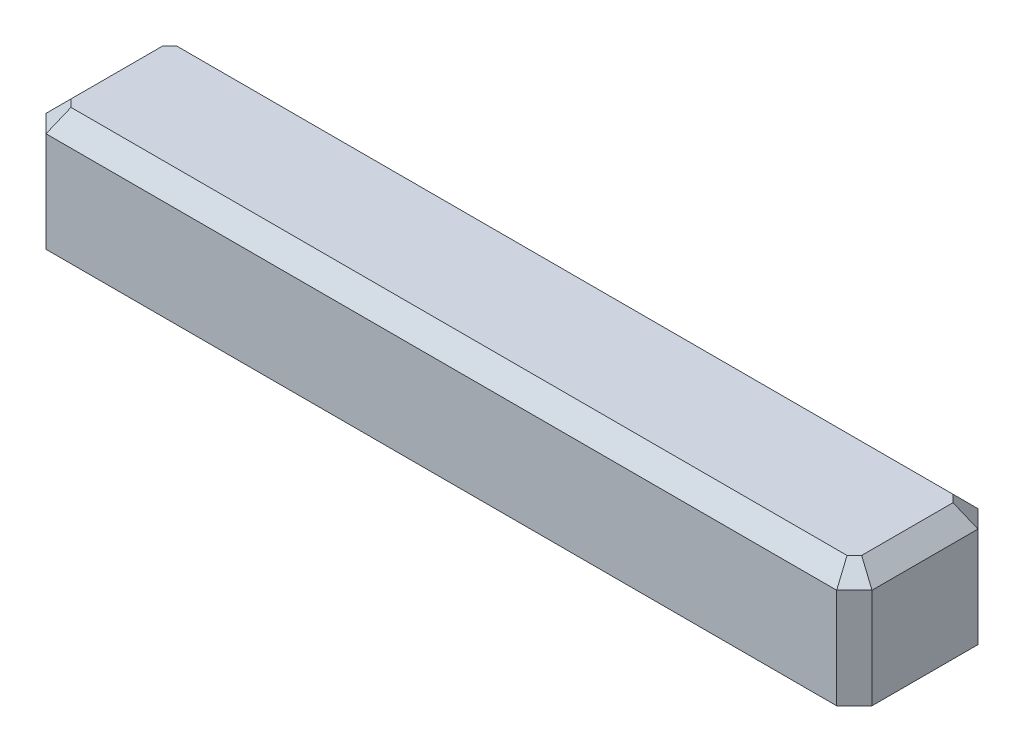
ISO-10303-21;
HEADER;
FILE_DESCRIPTION(('STEP AP214'),'2;1');
FILE_NAME('part.step','',(''),(''),'','','');
FILE_SCHEMA(('AUTOMOTIVE_DESIGN { 1 0 10303 214 1 1 1 1 }'));
ENDSEC;
DATA;
#1=APPLICATION_CONTEXT('core data for automotive mechanical design processes');
#2=APPLICATION_PROTOCOL_DEFINITION('international standard','automotive_design',2000,#1);
#3=PRODUCT_CONTEXT('',#1,'mechanical');
#4=PRODUCT('Part','Part','',(#3));
#5=PRODUCT_RELATED_PRODUCT_CATEGORY('part','',(#4));
#6=PRODUCT_DEFINITION_FORMATION('','',#4);
#7=PRODUCT_DEFINITION_CONTEXT('part definition',#1,'design');
#8=PRODUCT_DEFINITION('design','',#6,#7);
#9=PRODUCT_DEFINITION_SHAPE('','',#8);
#10=(LENGTH_UNIT() NAMED_UNIT(*) SI_UNIT(.MILLI.,.METRE.));
#11=(NAMED_UNIT(*) PLANE_ANGLE_UNIT() SI_UNIT($,.RADIAN.));
#12=(NAMED_UNIT(*) SI_UNIT($,.STERADIAN.) SOLID_ANGLE_UNIT());
#13=UNCERTAINTY_MEASURE_WITH_UNIT(LENGTH_MEASURE(1.E-05),#10,'distance_accuracy_value','');
#14=(GEOMETRIC_REPRESENTATION_CONTEXT(3) GLOBAL_UNCERTAINTY_ASSIGNED_CONTEXT((#13)) GLOBAL_UNIT_ASSIGNED_CONTEXT((#10,
#11,#12)) REPRESENTATION_CONTEXT('',''));
#15=CARTESIAN_POINT('',(0.,0.,0.));
#16=DIRECTION('',(0.,0.,1.));
#17=DIRECTION('',(1.,0.,0.));
#18=AXIS2_PLACEMENT_3D('',#15,#16,#17);
#19=CARTESIAN_POINT('',(-35.07,10.,4.5));
#20=DIRECTION('',(1.,0.,0.));
#21=DIRECTION('',(0.,0.,-1.));
#22=AXIS2_PLACEMENT_3D('',#19,#20,#21);
#23=PLANE('',#22);
#24=DIRECTION('',(0.,-1.,0.));
#25=VECTOR('',#24,1.);
#26=CARTESIAN_POINT('',(-35.07,10.,4.5));
#27=LINE('',#26,#25);
#28=CARTESIAN_POINT('',(-35.07,8.49999999999999,4.5));
#29=VERTEX_POINT('',#28);
#30=CARTESIAN_POINT('',(-35.07,0.,4.5));
#31=VERTEX_POINT('',#30);
#32=EDGE_CURVE('E265',#29,#31,#27,.T.);
#33=ORIENTED_EDGE('',*,*,#32,.F.);
#34=DIRECTION('',(0.,0.,-1.));
#35=VECTOR('',#34,1.);
#36=CARTESIAN_POINT('',(-35.07,8.49999999999999,4.5));
#37=LINE('',#36,#35);
#38=CARTESIAN_POINT('',(-35.07,8.49999999999999,-4.5));
#39=VERTEX_POINT('',#38);
#40=EDGE_CURVE('E297',#29,#39,#37,.T.);
#41=ORIENTED_EDGE('',*,*,#40,.T.);
#42=DIRECTION('',(0.,-1.,0.));
#43=VECTOR('',#42,1.);
#44=CARTESIAN_POINT('',(-35.07,10.,-4.5));
#45=LINE('',#44,#43);
#46=CARTESIAN_POINT('',(-35.07,0.,-4.5));
#47=VERTEX_POINT('',#46);
#48=EDGE_CURVE('E244',#39,#47,#45,.T.);
#49=ORIENTED_EDGE('',*,*,#48,.T.);
#50=DIRECTION('',(0.,0.,1.));
#51=VECTOR('',#50,1.);
#52=CARTESIAN_POINT('',(-35.07,0.,4.5));
#53=LINE('',#52,#51);
#54=EDGE_CURVE('E212',#47,#31,#53,.T.);
#55=ORIENTED_EDGE('',*,*,#54,.T.);
#56=EDGE_LOOP('',(#33,#41,#49,#55));
#57=FACE_BOUND('',#56,.T.);
#58=ADVANCED_FACE('F45',(#57),#23,.F.);
#59=CARTESIAN_POINT('',(-35.07,10.,4.5));
#60=DIRECTION('',(0.707106781186546,0.,-0.707106781186549));
#61=DIRECTION('',(-0.707106781186549,0.,-0.707106781186546));
#62=AXIS2_PLACEMENT_3D('',#59,#60,#61);
#63=PLANE('',#62);
#64=DIRECTION('',(0.,-1.,0.));
#65=VECTOR('',#64,1.);
#66=CARTESIAN_POINT('',(-33.57,10.,6.));
#67=LINE('',#66,#65);
#68=CARTESIAN_POINT('',(-33.57,8.49999999999999,6.));
#69=VERTEX_POINT('',#68);
#70=CARTESIAN_POINT('',(-33.57,0.,6.));
#71=VERTEX_POINT('',#70);
#72=EDGE_CURVE('E262',#69,#71,#67,.T.);
#73=ORIENTED_EDGE('',*,*,#72,.F.);
#74=DIRECTION('',(-0.707106781186549,0.,-0.707106781186546));
#75=VECTOR('',#74,1.);
#76=CARTESIAN_POINT('',(-35.07,8.49999999999998,4.5));
#77=LINE('',#76,#75);
#78=EDGE_CURVE('E293',#69,#29,#77,.T.);
#79=ORIENTED_EDGE('',*,*,#78,.T.);
#80=ORIENTED_EDGE('',*,*,#32,.T.);
#81=DIRECTION('',(0.707106781186549,0.,0.707106781186546));
#82=VECTOR('',#81,1.);
#83=CARTESIAN_POINT('',(-35.07,0.,4.5));
#84=LINE('',#83,#82);
#85=EDGE_CURVE('E216',#31,#71,#84,.T.);
#86=ORIENTED_EDGE('',*,*,#85,.T.);
#87=EDGE_LOOP('',(#73,#79,#80,#86));
#88=FACE_BOUND('',#87,.T.);
#89=ADVANCED_FACE('F401',(#88),#63,.F.);
#90=CARTESIAN_POINT('',(-33.57,10.,6.));
#91=DIRECTION('',(0.,0.,-1.));
#92=DIRECTION('',(-1.,0.,0.));
#93=AXIS2_PLACEMENT_3D('',#90,#91,#92);
#94=PLANE('',#93);
#95=DIRECTION('',(0.,-1.,0.));
#96=VECTOR('',#95,1.);
#97=CARTESIAN_POINT('',(33.57,10.,6.));
#98=LINE('',#97,#96);
#99=CARTESIAN_POINT('',(33.57,8.49999999999999,6.));
#100=VERTEX_POINT('',#99);
#101=CARTESIAN_POINT('',(33.57,0.,6.));
#102=VERTEX_POINT('',#101);
#103=EDGE_CURVE('E259',#100,#102,#98,.T.);
#104=ORIENTED_EDGE('',*,*,#103,.F.);
#105=DIRECTION('',(-1.,0.,0.));
#106=VECTOR('',#105,1.);
#107=CARTESIAN_POINT('',(-33.57,8.49999999999999,6.));
#108=LINE('',#107,#106);
#109=EDGE_CURVE('E11',#100,#69,#108,.T.);
#110=ORIENTED_EDGE('',*,*,#109,.T.);
#111=ORIENTED_EDGE('',*,*,#72,.T.);
#112=DIRECTION('',(1.,0.,0.));
#113=VECTOR('',#112,1.);
#114=CARTESIAN_POINT('',(-33.57,0.,6.));
#115=LINE('',#114,#113);
#116=EDGE_CURVE('E220',#71,#102,#115,.T.);
#117=ORIENTED_EDGE('',*,*,#116,.T.);
#118=EDGE_LOOP('',(#104,#110,#111,#117));
#119=FACE_BOUND('',#118,.T.);
#120=ADVANCED_FACE('F398',(#119),#94,.F.);
#121=CARTESIAN_POINT('',(33.57,10.,6.));
#122=DIRECTION('',(-0.707106781186549,0.,-0.707106781186546));
#123=DIRECTION('',(-0.707106781186546,0.,0.707106781186549));
#124=AXIS2_PLACEMENT_3D('',#121,#122,#123);
#125=PLANE('',#124);
#126=DIRECTION('',(0.,-1.,0.));
#127=VECTOR('',#126,1.);
#128=CARTESIAN_POINT('',(35.07,10.,4.5));
#129=LINE('',#128,#127);
#130=CARTESIAN_POINT('',(35.07,8.49999999999999,4.5));
#131=VERTEX_POINT('',#130);
#132=CARTESIAN_POINT('',(35.07,0.,4.5));
#133=VERTEX_POINT('',#132);
#134=EDGE_CURVE('E256',#131,#133,#129,.T.);
#135=ORIENTED_EDGE('',*,*,#134,.F.);
#136=DIRECTION('',(-0.707106781186546,0.,0.707106781186549));
#137=VECTOR('',#136,1.);
#138=CARTESIAN_POINT('',(33.57,8.49999999999999,6.));
#139=LINE('',#138,#137);
#140=EDGE_CURVE('E56',#131,#100,#139,.T.);
#141=ORIENTED_EDGE('',*,*,#140,.T.);
#142=ORIENTED_EDGE('',*,*,#103,.T.);
#143=DIRECTION('',(0.707106781186546,0.,-0.707106781186549));
#144=VECTOR('',#143,1.);
#145=CARTESIAN_POINT('',(33.57,0.,6.));
#146=LINE('',#145,#144);
#147=EDGE_CURVE('E224',#102,#133,#146,.T.);
#148=ORIENTED_EDGE('',*,*,#147,.T.);
#149=EDGE_LOOP('',(#135,#141,#142,#148));
#150=FACE_BOUND('',#149,.T.);
#151=ADVANCED_FACE('F427',(#150),#125,.F.);
#152=CARTESIAN_POINT('',(35.07,10.,4.5));
#153=DIRECTION('',(-1.,0.,0.));
#154=DIRECTION('',(0.,0.,1.));
#155=AXIS2_PLACEMENT_3D('',#152,#153,#154);
#156=PLANE('',#155);
#157=DIRECTION('',(0.,-1.,0.));
#158=VECTOR('',#157,1.);
#159=CARTESIAN_POINT('',(35.07,10.,-4.5));
#160=LINE('',#159,#158);
#161=CARTESIAN_POINT('',(35.07,8.49999999999999,-4.5));
#162=VERTEX_POINT('',#161);
#163=CARTESIAN_POINT('',(35.07,0.,-4.5));
#164=VERTEX_POINT('',#163);
#165=EDGE_CURVE('E253',#162,#164,#160,.T.);
#166=ORIENTED_EDGE('',*,*,#165,.F.);
#167=DIRECTION('',(0.,0.,1.));
#168=VECTOR('',#167,1.);
#169=CARTESIAN_POINT('',(35.07,8.49999999999999,4.5));
#170=LINE('',#169,#168);
#171=EDGE_CURVE('E309',#162,#131,#170,.T.);
#172=ORIENTED_EDGE('',*,*,#171,.T.);
#173=ORIENTED_EDGE('',*,*,#134,.T.);
#174=DIRECTION('',(0.,0.,-1.));
#175=VECTOR('',#174,1.);
#176=CARTESIAN_POINT('',(35.07,0.,4.5));
#177=LINE('',#176,#175);
#178=EDGE_CURVE('E228',#133,#164,#177,.T.);
#179=ORIENTED_EDGE('',*,*,#178,.T.);
#180=EDGE_LOOP('',(#166,#172,#173,#179));
#181=FACE_BOUND('',#180,.T.);
#182=ADVANCED_FACE('F357',(#181),#156,.F.);
#183=CARTESIAN_POINT('',(33.57,10.,-6.));
#184=DIRECTION('',(-0.707106781186549,0.,0.707106781186546));
#185=DIRECTION('',(0.707106781186546,0.,0.707106781186549));
#186=AXIS2_PLACEMENT_3D('',#183,#184,#185);
#187=PLANE('',#186);
#188=DIRECTION('',(0.,-1.,0.));
#189=VECTOR('',#188,1.);
#190=CARTESIAN_POINT('',(33.57,10.,-6.));
#191=LINE('',#190,#189);
#192=CARTESIAN_POINT('',(33.57,8.49999999999999,-6.));
#193=VERTEX_POINT('',#192);
#194=CARTESIAN_POINT('',(33.57,0.,-6.));
#195=VERTEX_POINT('',#194);
#196=EDGE_CURVE('E250',#193,#195,#191,.T.);
#197=ORIENTED_EDGE('',*,*,#196,.F.);
#198=DIRECTION('',(0.707106781186546,0.,0.707106781186549));
#199=VECTOR('',#198,1.);
#200=CARTESIAN_POINT('',(33.57,8.49999999999999,-6.));
#201=LINE('',#200,#199);
#202=EDGE_CURVE('E306',#193,#162,#201,.T.);
#203=ORIENTED_EDGE('',*,*,#202,.T.);
#204=ORIENTED_EDGE('',*,*,#165,.T.);
#205=DIRECTION('',(-0.707106781186546,0.,-0.707106781186549));
#206=VECTOR('',#205,1.);
#207=CARTESIAN_POINT('',(33.57,0.,-6.));
#208=LINE('',#207,#206);
#209=EDGE_CURVE('E232',#164,#195,#208,.T.);
#210=ORIENTED_EDGE('',*,*,#209,.T.);
#211=EDGE_LOOP('',(#197,#203,#204,#210));
#212=FACE_BOUND('',#211,.T.);
#213=ADVANCED_FACE('F355',(#212),#187,.F.);
#214=CARTESIAN_POINT('',(-33.57,10.,-6.));
#215=DIRECTION('',(0.,0.,1.));
#216=DIRECTION('',(1.,0.,0.));
#217=AXIS2_PLACEMENT_3D('',#214,#215,#216);
#218=PLANE('',#217);
#219=DIRECTION('',(0.,-1.,0.));
#220=VECTOR('',#219,1.);
#221=CARTESIAN_POINT('',(-33.57,10.,-6.));
#222=LINE('',#221,#220);
#223=CARTESIAN_POINT('',(-33.57,8.49999999999999,-6.));
#224=VERTEX_POINT('',#223);
#225=CARTESIAN_POINT('',(-33.57,0.,-6.));
#226=VERTEX_POINT('',#225);
#227=EDGE_CURVE('E247',#224,#226,#222,.T.);
#228=ORIENTED_EDGE('',*,*,#227,.F.);
#229=DIRECTION('',(1.,0.,0.));
#230=VECTOR('',#229,1.);
#231=CARTESIAN_POINT('',(-33.57,8.49999999999999,-6.));
#232=LINE('',#231,#230);
#233=EDGE_CURVE('E303',#224,#193,#232,.T.);
#234=ORIENTED_EDGE('',*,*,#233,.T.);
#235=ORIENTED_EDGE('',*,*,#196,.T.);
#236=DIRECTION('',(-1.,0.,0.));
#237=VECTOR('',#236,1.);
#238=CARTESIAN_POINT('',(-33.57,0.,-6.));
#239=LINE('',#238,#237);
#240=EDGE_CURVE('E236',#195,#226,#239,.T.);
#241=ORIENTED_EDGE('',*,*,#240,.T.);
#242=EDGE_LOOP('',(#228,#234,#235,#241));
#243=FACE_BOUND('',#242,.T.);
#244=ADVANCED_FACE('F368',(#243),#218,.F.);
#245=CARTESIAN_POINT('',(-35.07,10.,-4.5));
#246=DIRECTION('',(0.707106781186546,0.,0.707106781186549));
#247=DIRECTION('',(0.707106781186549,0.,-0.707106781186546));
#248=AXIS2_PLACEMENT_3D('',#245,#246,#247);
#249=PLANE('',#248);
#250=ORIENTED_EDGE('',*,*,#48,.F.);
#251=DIRECTION('',(0.707106781186549,0.,-0.707106781186546));
#252=VECTOR('',#251,1.);
#253=CARTESIAN_POINT('',(-35.07,8.49999999999999,-4.5));
#254=LINE('',#253,#252);
#255=EDGE_CURVE('E300',#39,#224,#254,.T.);
#256=ORIENTED_EDGE('',*,*,#255,.T.);
#257=ORIENTED_EDGE('',*,*,#227,.T.);
#258=DIRECTION('',(-0.707106781186549,0.,0.707106781186546));
#259=VECTOR('',#258,1.);
#260=CARTESIAN_POINT('',(-35.07,0.,-4.5));
#261=LINE('',#260,#259);
#262=EDGE_CURVE('E240',#226,#47,#261,.T.);
#263=ORIENTED_EDGE('',*,*,#262,.T.);
#264=EDGE_LOOP('',(#250,#256,#257,#263));
#265=FACE_BOUND('',#264,.T.);
#266=ADVANCED_FACE('F371',(#265),#249,.F.);
#267=CARTESIAN_POINT('',(0.,10.,0.));
#268=DIRECTION('',(0.,-1.,0.));
#269=DIRECTION('',(0.,0.,-1.));
#270=AXIS2_PLACEMENT_3D('',#267,#268,#269);
#271=PLANE('',#270);
#272=DIRECTION('',(0.,0.,1.));
#273=VECTOR('',#272,1.);
#274=CARTESIAN_POINT('',(-33.57,10.,0.));
#275=LINE('',#274,#273);
#276=CARTESIAN_POINT('',(-33.57,10.,-3.87867965644035));
#277=VERTEX_POINT('',#276);
#278=CARTESIAN_POINT('',(-33.57,10.,3.87867965644035));
#279=VERTEX_POINT('',#278);
#280=EDGE_CURVE('E286',#277,#279,#275,.T.);
#281=ORIENTED_EDGE('',*,*,#280,.T.);
#282=DIRECTION('',(0.707106781186549,0.,0.707106781186546));
#283=VECTOR('',#282,1.);
#284=CARTESIAN_POINT('',(-18.7243398282201,10.,18.7243398282202));
#285=LINE('',#284,#283);
#286=CARTESIAN_POINT('',(-32.9486796564404,10.,4.49999999999999));
#287=VERTEX_POINT('',#286);
#288=EDGE_CURVE('E289',#279,#287,#285,.T.);
#289=ORIENTED_EDGE('',*,*,#288,.T.);
#290=DIRECTION('',(1.,0.,0.));
#291=VECTOR('',#290,1.);
#292=CARTESIAN_POINT('',(0.,10.,4.49999999999999));
#293=LINE('',#292,#291);
#294=CARTESIAN_POINT('',(32.9486796564403,10.,4.49999999999999));
#295=VERTEX_POINT('',#294);
#296=EDGE_CURVE('E268',#287,#295,#293,.T.);
#297=ORIENTED_EDGE('',*,*,#296,.T.);
#298=DIRECTION('',(0.707106781186546,0.,-0.707106781186549));
#299=VECTOR('',#298,1.);
#300=CARTESIAN_POINT('',(18.7243398282202,10.,18.7243398282202));
#301=LINE('',#300,#299);
#302=CARTESIAN_POINT('',(33.57,10.,3.87867965644035));
#303=VERTEX_POINT('',#302);
#304=EDGE_CURVE('E271',#295,#303,#301,.T.);
#305=ORIENTED_EDGE('',*,*,#304,.T.);
#306=DIRECTION('',(0.,0.,-1.));
#307=VECTOR('',#306,1.);
#308=CARTESIAN_POINT('',(33.57,10.,0.));
#309=LINE('',#308,#307);
#310=CARTESIAN_POINT('',(33.57,10.,-3.87867965644035));
#311=VERTEX_POINT('',#310);
#312=EDGE_CURVE('E274',#303,#311,#309,.T.);
#313=ORIENTED_EDGE('',*,*,#312,.T.);
#314=DIRECTION('',(-0.707106781186546,0.,-0.707106781186549));
#315=VECTOR('',#314,1.);
#316=CARTESIAN_POINT('',(18.7243398282202,10.,-18.7243398282202));
#317=LINE('',#316,#315);
#318=CARTESIAN_POINT('',(32.9486796564403,10.,-4.49999999999999));
#319=VERTEX_POINT('',#318);
#320=EDGE_CURVE('E277',#311,#319,#317,.T.);
#321=ORIENTED_EDGE('',*,*,#320,.T.);
#322=DIRECTION('',(-1.,0.,0.));
#323=VECTOR('',#322,1.);
#324=CARTESIAN_POINT('',(0.,10.,-4.49999999999999));
#325=LINE('',#324,#323);
#326=CARTESIAN_POINT('',(-32.9486796564404,10.,-4.49999999999999));
#327=VERTEX_POINT('',#326);
#328=EDGE_CURVE('E280',#319,#327,#325,.T.);
#329=ORIENTED_EDGE('',*,*,#328,.T.);
#330=DIRECTION('',(-0.707106781186549,0.,0.707106781186546));
#331=VECTOR('',#330,1.);
#332=CARTESIAN_POINT('',(-18.7243398282201,10.,-18.7243398282202));
#333=LINE('',#332,#331);
#334=EDGE_CURVE('E283',#327,#277,#333,.T.);
#335=ORIENTED_EDGE('',*,*,#334,.T.);
#336=EDGE_LOOP('',(#281,#289,#297,#305,#313,#321,#329,#335));
#337=FACE_BOUND('',#336,.T.);
#338=ADVANCED_FACE('F384',(#337),#271,.F.);
#339=CARTESIAN_POINT('',(0.,0.,0.));
#340=DIRECTION('',(0.,-1.,0.));
#341=DIRECTION('',(0.,0.,-1.));
#342=AXIS2_PLACEMENT_3D('',#339,#340,#341);
#343=PLANE('',#342);
#344=DIRECTION('',(0.,0.,-1.));
#345=VECTOR('',#344,1.);
#346=CARTESIAN_POINT('',(-30.67,0.,0.8));
#347=LINE('',#346,#345);
#348=CARTESIAN_POINT('',(-30.67,0.,0.8));
#349=VERTEX_POINT('',#348);
#350=CARTESIAN_POINT('',(-30.67,0.,-3.));
#351=VERTEX_POINT('',#350);
#352=EDGE_CURVE('E64',#349,#351,#347,.T.);
#353=ORIENTED_EDGE('',*,*,#352,.F.);
#354=DIRECTION('',(-1.,0.,0.));
#355=VECTOR('',#354,1.);
#356=CARTESIAN_POINT('',(-30.67,0.,0.8));
#357=LINE('',#356,#355);
#358=CARTESIAN_POINT('',(30.67,0.,0.800000000000038));
#359=VERTEX_POINT('',#358);
#360=EDGE_CURVE('E184',#359,#349,#357,.T.);
#361=ORIENTED_EDGE('',*,*,#360,.F.);
#362=DIRECTION('',(0.,0.,1.));
#363=VECTOR('',#362,1.);
#364=CARTESIAN_POINT('',(30.67,0.,0.800000000000038));
#365=LINE('',#364,#363);
#366=CARTESIAN_POINT('',(30.67,0.,-3.));
#367=VERTEX_POINT('',#366);
#368=EDGE_CURVE('E188',#367,#359,#365,.T.);
#369=ORIENTED_EDGE('',*,*,#368,.F.);
#370=DIRECTION('',(1.,0.,0.));
#371=VECTOR('',#370,1.);
#372=CARTESIAN_POINT('',(-30.67,0.,-3.));
#373=LINE('',#372,#371);
#374=EDGE_CURVE('E197',#351,#367,#373,.T.);
#375=ORIENTED_EDGE('',*,*,#374,.F.);
#376=EDGE_LOOP('',(#353,#361,#369,#375));
#377=FACE_BOUND('',#376,.T.);
#378=ORIENTED_EDGE('',*,*,#54,.F.);
#379=ORIENTED_EDGE('',*,*,#262,.F.);
#380=ORIENTED_EDGE('',*,*,#240,.F.);
#381=ORIENTED_EDGE('',*,*,#209,.F.);
#382=ORIENTED_EDGE('',*,*,#178,.F.);
#383=ORIENTED_EDGE('',*,*,#147,.F.);
#384=ORIENTED_EDGE('',*,*,#116,.F.);
#385=ORIENTED_EDGE('',*,*,#85,.F.);
#386=EDGE_LOOP('',(#378,#379,#380,#381,#382,#383,#384,#385));
#387=FACE_BOUND('',#386,.T.);
#388=ADVANCED_FACE('F364',(#377,#387),#343,.T.);
#389=CARTESIAN_POINT('',(18.7243398282202,10.,-18.7243398282202));
#390=DIRECTION('',(-0.500000000000002,-0.707106781186547,0.499999999999999));
#391=DIRECTION('',(-0.707106781186546,0.,-0.707106781186549));
#392=AXIS2_PLACEMENT_3D('',#389,#390,#391);
#393=PLANE('',#392);
#394=DIRECTION('',(-0.678598344545845,0.678598344545848,0.281084637714822));
#395=VECTOR('',#394,1.);
#396=CARTESIAN_POINT('',(32.8301667961014,10.7398332038986,-3.57223070949163));
#397=LINE('',#396,#395);
#398=EDGE_CURVE('E334',#162,#311,#397,.T.);
#399=ORIENTED_EDGE('',*,*,#398,.F.);
#400=ORIENTED_EDGE('',*,*,#202,.F.);
#401=DIRECTION('',(-0.281084637714824,0.678598344545848,0.678598344545845));
#402=VECTOR('',#401,1.);
#403=CARTESIAN_POINT('',(34.5380362141079,6.16295384303249,-8.33704615696748));
#404=LINE('',#403,#402);
#405=EDGE_CURVE('E50',#319,#193,#404,.F.);
#406=ORIENTED_EDGE('',*,*,#405,.F.);
#407=ORIENTED_EDGE('',*,*,#320,.F.);
#408=EDGE_LOOP('',(#399,#400,#406,#407));
#409=FACE_BOUND('',#408,.T.);
#410=ADVANCED_FACE('F48',(#409),#393,.F.);
#411=CARTESIAN_POINT('',(0.,10.,-4.49999999999999));
#412=DIRECTION('',(0.,-0.707106781186546,0.707106781186549));
#413=DIRECTION('',(-1.,0.,0.));
#414=AXIS2_PLACEMENT_3D('',#411,#412,#413);
#415=PLANE('',#414);
#416=ORIENTED_EDGE('',*,*,#405,.T.);
#417=ORIENTED_EDGE('',*,*,#233,.F.);
#418=DIRECTION('',(0.281084637714821,0.678598344545849,0.678598344545845));
#419=VECTOR('',#418,1.);
#420=CARTESIAN_POINT('',(-30.3454514761236,16.2847487788726,1.78474877887253));
#421=LINE('',#420,#419);
#422=EDGE_CURVE('E331',#327,#224,#421,.F.);
#423=ORIENTED_EDGE('',*,*,#422,.F.);
#424=ORIENTED_EDGE('',*,*,#328,.F.);
#425=EDGE_LOOP('',(#416,#417,#423,#424));
#426=FACE_BOUND('',#425,.T.);
#427=ADVANCED_FACE('F347',(#426),#415,.F.);
#428=CARTESIAN_POINT('',(33.57,10.,0.));
#429=DIRECTION('',(-0.707106781186549,-0.707106781186546,0.));
#430=DIRECTION('',(0.,0.,-1.));
#431=AXIS2_PLACEMENT_3D('',#428,#429,#430);
#432=PLANE('',#431);
#433=ORIENTED_EDGE('',*,*,#398,.T.);
#434=ORIENTED_EDGE('',*,*,#312,.F.);
#435=DIRECTION('',(-0.678598344545845,0.678598344545848,-0.281084637714822));
#436=VECTOR('',#435,1.);
#437=CARTESIAN_POINT('',(29.5653513486256,14.0046486513744,2.21989987250194));
#438=LINE('',#437,#436);
#439=EDGE_CURVE('E327',#131,#303,#438,.T.);
#440=ORIENTED_EDGE('',*,*,#439,.F.);
#441=ORIENTED_EDGE('',*,*,#171,.F.);
#442=EDGE_LOOP('',(#433,#434,#440,#441));
#443=FACE_BOUND('',#442,.T.);
#444=ADVANCED_FACE('F387',(#443),#432,.F.);
#445=CARTESIAN_POINT('',(-18.7243398282201,10.,-18.7243398282202));
#446=DIRECTION('',(0.499999999999999,-0.707106781186547,0.500000000000002));
#447=DIRECTION('',(-0.707106781186549,0.,0.707106781186546));
#448=AXIS2_PLACEMENT_3D('',#445,#446,#447);
#449=PLANE('',#448);
#450=ORIENTED_EDGE('',*,*,#422,.T.);
#451=ORIENTED_EDGE('',*,*,#255,.F.);
#452=DIRECTION('',(0.678598344545845,0.678598344545848,0.281084637714822));
#453=VECTOR('',#452,1.);
#454=CARTESIAN_POINT('',(-29.5653513486256,14.0046486513745,-2.21989987250191));
#455=LINE('',#454,#453);
#456=EDGE_CURVE('E323',#277,#39,#455,.F.);
#457=ORIENTED_EDGE('',*,*,#456,.F.);
#458=ORIENTED_EDGE('',*,*,#334,.F.);
#459=EDGE_LOOP('',(#450,#451,#457,#458));
#460=FACE_BOUND('',#459,.T.);
#461=ADVANCED_FACE('F375',(#460),#449,.F.);
#462=CARTESIAN_POINT('',(18.7243398282202,10.,18.7243398282202));
#463=DIRECTION('',(-0.500000000000002,-0.707106781186547,-0.499999999999999));
#464=DIRECTION('',(0.707106781186546,0.,-0.707106781186549));
#465=AXIS2_PLACEMENT_3D('',#462,#463,#464);
#466=PLANE('',#465);
#467=ORIENTED_EDGE('',*,*,#439,.T.);
#468=ORIENTED_EDGE('',*,*,#304,.F.);
#469=DIRECTION('',(-0.281084637714824,0.678598344545848,-0.678598344545845));
#470=VECTOR('',#469,1.);
#471=CARTESIAN_POINT('',(30.3454514761235,16.2847487788726,-1.78474877887258));
#472=LINE('',#471,#470);
#473=EDGE_CURVE('E319',#100,#295,#472,.T.);
#474=ORIENTED_EDGE('',*,*,#473,.F.);
#475=ORIENTED_EDGE('',*,*,#140,.F.);
#476=EDGE_LOOP('',(#467,#468,#474,#475));
#477=FACE_BOUND('',#476,.T.);
#478=ADVANCED_FACE('F389',(#477),#466,.F.);
#479=CARTESIAN_POINT('',(-33.57,10.,0.));
#480=DIRECTION('',(0.707106781186549,-0.707106781186546,0.));
#481=DIRECTION('',(0.,0.,1.));
#482=AXIS2_PLACEMENT_3D('',#479,#480,#481);
#483=PLANE('',#482);
#484=ORIENTED_EDGE('',*,*,#456,.T.);
#485=ORIENTED_EDGE('',*,*,#40,.F.);
#486=DIRECTION('',(0.678598344545845,0.678598344545848,-0.281084637714822));
#487=VECTOR('',#486,1.);
#488=CARTESIAN_POINT('',(-32.8301667961015,10.7398332038986,3.57223070949163));
#489=LINE('',#488,#487);
#490=EDGE_CURVE('E316',#279,#29,#489,.F.);
#491=ORIENTED_EDGE('',*,*,#490,.F.);
#492=ORIENTED_EDGE('',*,*,#280,.F.);
#493=EDGE_LOOP('',(#484,#485,#491,#492));
#494=FACE_BOUND('',#493,.T.);
#495=ADVANCED_FACE('F380',(#494),#483,.F.);
#496=CARTESIAN_POINT('',(0.,10.,4.49999999999999));
#497=DIRECTION('',(0.,-0.707106781186546,-0.707106781186549));
#498=DIRECTION('',(1.,0.,0.));
#499=AXIS2_PLACEMENT_3D('',#496,#497,#498);
#500=PLANE('',#499);
#501=ORIENTED_EDGE('',*,*,#473,.T.);
#502=ORIENTED_EDGE('',*,*,#296,.F.);
#503=DIRECTION('',(-0.28108463771482,-0.678598344545849,0.678598344545845));
#504=VECTOR('',#503,1.);
#505=CARTESIAN_POINT('',(-30.3454514761236,16.2847487788725,-1.78474877887251));
#506=LINE('',#505,#504);
#507=EDGE_CURVE('E206',#69,#287,#506,.F.);
#508=ORIENTED_EDGE('',*,*,#507,.F.);
#509=ORIENTED_EDGE('',*,*,#109,.F.);
#510=EDGE_LOOP('',(#501,#502,#508,#509));
#511=FACE_BOUND('',#510,.T.);
#512=ADVANCED_FACE('F395',(#511),#500,.F.);
#513=CARTESIAN_POINT('',(-18.7243398282201,10.,18.7243398282202));
#514=DIRECTION('',(0.5,-0.707106781186546,-0.500000000000002));
#515=DIRECTION('',(0.707106781186549,0.,0.707106781186546));
#516=AXIS2_PLACEMENT_3D('',#513,#514,#515);
#517=PLANE('',#516);
#518=ORIENTED_EDGE('',*,*,#490,.T.);
#519=ORIENTED_EDGE('',*,*,#78,.F.);
#520=ORIENTED_EDGE('',*,*,#507,.T.);
#521=ORIENTED_EDGE('',*,*,#288,.F.);
#522=EDGE_LOOP('',(#518,#519,#520,#521));
#523=FACE_BOUND('',#522,.T.);
#524=ADVANCED_FACE('F406',(#523),#517,.F.);
#525=CARTESIAN_POINT('',(-30.67,7.,0.8));
#526=DIRECTION('',(-1.,0.,0.));
#527=DIRECTION('',(0.,0.,1.));
#528=AXIS2_PLACEMENT_3D('',#525,#526,#527);
#529=PLANE('',#528);
#530=ORIENTED_EDGE('',*,*,#352,.T.);
#531=DIRECTION('',(0.,-1.,0.));
#532=VECTOR('',#531,1.);
#533=CARTESIAN_POINT('',(-30.67,7.,-3.));
#534=LINE('',#533,#532);
#535=CARTESIAN_POINT('',(-30.67,7.,-3.));
#536=VERTEX_POINT('',#535);
#537=EDGE_CURVE('E159',#536,#351,#534,.T.);
#538=ORIENTED_EDGE('',*,*,#537,.F.);
#539=DIRECTION('',(0.,0.,-1.));
#540=VECTOR('',#539,1.);
#541=CARTESIAN_POINT('',(-30.67,7.,0.8));
#542=LINE('',#541,#540);
#543=CARTESIAN_POINT('',(-30.67,7.,0.8));
#544=VERTEX_POINT('',#543);
#545=EDGE_CURVE('E163',#544,#536,#542,.T.);
#546=ORIENTED_EDGE('',*,*,#545,.F.);
#547=DIRECTION('',(0.,-1.,0.));
#548=VECTOR('',#547,1.);
#549=CARTESIAN_POINT('',(-30.67,7.,0.8));
#550=LINE('',#549,#548);
#551=EDGE_CURVE('E203',#544,#349,#550,.T.);
#552=ORIENTED_EDGE('',*,*,#551,.T.);
#553=EDGE_LOOP('',(#530,#538,#546,#552));
#554=FACE_BOUND('',#553,.T.);
#555=ADVANCED_FACE('F161',(#554),#529,.F.);
#556=CARTESIAN_POINT('',(-30.67,7.,0.8));
#557=DIRECTION('',(0.,0.,1.));
#558=DIRECTION('',(1.,0.,0.));
#559=AXIS2_PLACEMENT_3D('',#556,#557,#558);
#560=PLANE('',#559);
#561=ORIENTED_EDGE('',*,*,#360,.T.);
#562=ORIENTED_EDGE('',*,*,#551,.F.);
#563=DIRECTION('',(-1.,0.,0.));
#564=VECTOR('',#563,1.);
#565=CARTESIAN_POINT('',(-30.67,7.,0.8));
#566=LINE('',#565,#564);
#567=CARTESIAN_POINT('',(30.67,7.,0.800000000000038));
#568=VERTEX_POINT('',#567);
#569=EDGE_CURVE('E170',#568,#544,#566,.T.);
#570=ORIENTED_EDGE('',*,*,#569,.F.);
#571=DIRECTION('',(0.,-1.,0.));
#572=VECTOR('',#571,1.);
#573=CARTESIAN_POINT('',(30.67,7.,0.800000000000038));
#574=LINE('',#573,#572);
#575=EDGE_CURVE('E207',#568,#359,#574,.T.);
#576=ORIENTED_EDGE('',*,*,#575,.T.);
#577=EDGE_LOOP('',(#561,#562,#570,#576));
#578=FACE_BOUND('',#577,.T.);
#579=ADVANCED_FACE('F413',(#578),#560,.F.);
#580=CARTESIAN_POINT('',(30.67,7.,0.800000000000038));
#581=DIRECTION('',(1.,0.,0.));
#582=DIRECTION('',(0.,0.,-1.));
#583=AXIS2_PLACEMENT_3D('',#580,#581,#582);
#584=PLANE('',#583);
#585=ORIENTED_EDGE('',*,*,#368,.T.);
#586=ORIENTED_EDGE('',*,*,#575,.F.);
#587=DIRECTION('',(0.,0.,1.));
#588=VECTOR('',#587,1.);
#589=CARTESIAN_POINT('',(30.67,7.,0.800000000000038));
#590=LINE('',#589,#588);
#591=CARTESIAN_POINT('',(30.67,7.,-3.));
#592=VERTEX_POINT('',#591);
#593=EDGE_CURVE('E179',#592,#568,#590,.T.);
#594=ORIENTED_EDGE('',*,*,#593,.F.);
#595=DIRECTION('',(0.,-1.,0.));
#596=VECTOR('',#595,1.);
#597=CARTESIAN_POINT('',(30.67,7.,-3.));
#598=LINE('',#597,#596);
#599=EDGE_CURVE('E169',#592,#367,#598,.T.);
#600=ORIENTED_EDGE('',*,*,#599,.T.);
#601=EDGE_LOOP('',(#585,#586,#594,#600));
#602=FACE_BOUND('',#601,.T.);
#603=ADVANCED_FACE('F445',(#602),#584,.F.);
#604=CARTESIAN_POINT('',(-30.67,7.,-3.));
#605=DIRECTION('',(0.,0.,-1.));
#606=DIRECTION('',(-1.,0.,0.));
#607=AXIS2_PLACEMENT_3D('',#604,#605,#606);
#608=PLANE('',#607);
#609=ORIENTED_EDGE('',*,*,#374,.T.);
#610=ORIENTED_EDGE('',*,*,#599,.F.);
#611=DIRECTION('',(1.,0.,0.));
#612=VECTOR('',#611,1.);
#613=CARTESIAN_POINT('',(-30.67,7.,-3.));
#614=LINE('',#613,#612);
#615=EDGE_CURVE('E173',#536,#592,#614,.T.);
#616=ORIENTED_EDGE('',*,*,#615,.F.);
#617=ORIENTED_EDGE('',*,*,#537,.T.);
#618=EDGE_LOOP('',(#609,#610,#616,#617));
#619=FACE_BOUND('',#618,.T.);
#620=ADVANCED_FACE('F174',(#619),#608,.F.);
#621=CARTESIAN_POINT('',(0.,7.,0.));
#622=DIRECTION('',(0.,-1.,0.));
#623=DIRECTION('',(0.,0.,-1.));
#624=AXIS2_PLACEMENT_3D('',#621,#622,#623);
#625=PLANE('',#624);
#626=ORIENTED_EDGE('',*,*,#545,.T.);
#627=ORIENTED_EDGE('',*,*,#615,.T.);
#628=ORIENTED_EDGE('',*,*,#593,.T.);
#629=ORIENTED_EDGE('',*,*,#569,.T.);
#630=EDGE_LOOP('',(#626,#627,#628,#629));
#631=FACE_BOUND('',#630,.T.);
#632=ADVANCED_FACE('F181',(#631),#625,.T.);
#633=CLOSED_SHELL('',(#58,#89,#120,#151,#182,#213,#244,#266,#338,#388,#410,#427,#444,#461,#478,
#495,#512,#524,#555,#579,#603,#620,#632));
#634=MANIFOLD_SOLID_BREP('B2',#633);
#635=ADVANCED_BREP_SHAPE_REPRESENTATION('',(#18,#634),#14);
#636=SHAPE_DEFINITION_REPRESENTATION(#9,#635);
ENDSEC;
END-ISO-10303-21;
